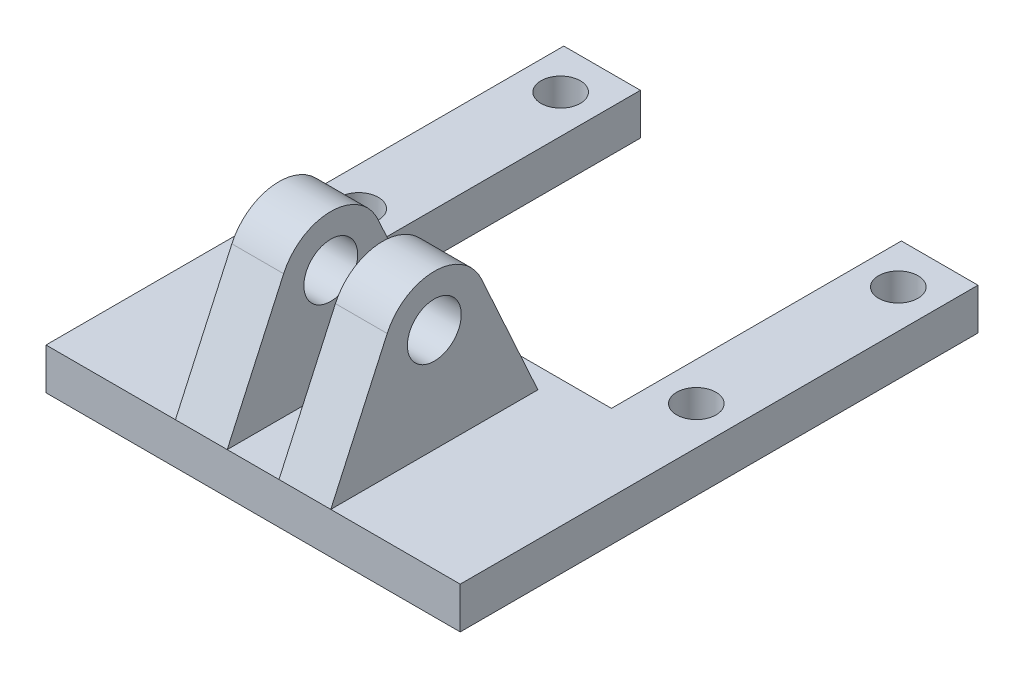
ISO-10303-21;
HEADER;
FILE_DESCRIPTION(('STEP AP214'),'2;1');
FILE_NAME('part.step','',(''),(''),'','','');
FILE_SCHEMA(('AUTOMOTIVE_DESIGN { 1 0 10303 214 1 1 1 1 }'));
ENDSEC;
DATA;
#1=APPLICATION_CONTEXT('core data for automotive mechanical design processes');
#2=APPLICATION_PROTOCOL_DEFINITION('international standard','automotive_design',2000,#1);
#3=PRODUCT_CONTEXT('',#1,'mechanical');
#4=PRODUCT('Part','Part','',(#3));
#5=PRODUCT_RELATED_PRODUCT_CATEGORY('part','',(#4));
#6=PRODUCT_DEFINITION_FORMATION('','',#4);
#7=PRODUCT_DEFINITION_CONTEXT('part definition',#1,'design');
#8=PRODUCT_DEFINITION('design','',#6,#7);
#9=PRODUCT_DEFINITION_SHAPE('','',#8);
#10=(LENGTH_UNIT() NAMED_UNIT(*) SI_UNIT(.MILLI.,.METRE.));
#11=(NAMED_UNIT(*) PLANE_ANGLE_UNIT() SI_UNIT($,.RADIAN.));
#12=(NAMED_UNIT(*) SI_UNIT($,.STERADIAN.) SOLID_ANGLE_UNIT());
#13=UNCERTAINTY_MEASURE_WITH_UNIT(LENGTH_MEASURE(1.E-05),#10,'distance_accuracy_value','');
#14=(GEOMETRIC_REPRESENTATION_CONTEXT(3) GLOBAL_UNCERTAINTY_ASSIGNED_CONTEXT((#13)) GLOBAL_UNIT_ASSIGNED_CONTEXT((#10,
#11,#12)) REPRESENTATION_CONTEXT('',''));
#15=CARTESIAN_POINT('',(0.,0.,0.));
#16=DIRECTION('',(0.,0.,1.));
#17=DIRECTION('',(1.,0.,0.));
#18=AXIS2_PLACEMENT_3D('',#15,#16,#17);
#19=CARTESIAN_POINT('',(4.7625,16.51,-6.35));
#20=DIRECTION('',(0.,-0.413802944301184,-0.910366477462605));
#21=DIRECTION('',(0.,0.910366477462605,-0.413802944301184));
#22=AXIS2_PLACEMENT_3D('',#19,#20,#21);
#23=PLANE('',#22);
#24=DIRECTION('',(0.,-0.910366477462605,0.413802944301184));
#25=VECTOR('',#24,1.);
#26=CARTESIAN_POINT('',(-1.5875,16.51,-6.35));
#27=LINE('',#26,#25);
#28=CARTESIAN_POINT('',(-1.5875,10.1510901549237,-3.45958643405622));
#29=VERTEX_POINT('',#28);
#30=CARTESIAN_POINT('',(-1.5875,2.54,0.));
#31=VERTEX_POINT('',#30);
#32=EDGE_CURVE('E157',#29,#31,#27,.T.);
#33=ORIENTED_EDGE('',*,*,#32,.F.);
#34=DIRECTION('',(-1.,0.,0.));
#35=VECTOR('',#34,1.);
#36=CARTESIAN_POINT('',(4.7625,10.1510901549237,-3.45958643405623));
#37=LINE('',#36,#35);
#38=CARTESIAN_POINT('',(-4.7625,10.1510901549237,-3.45958643405623));
#39=VERTEX_POINT('',#38);
#40=EDGE_CURVE('E320',#29,#39,#37,.T.);
#41=ORIENTED_EDGE('',*,*,#40,.T.);
#42=DIRECTION('',(0.,-0.910366477462605,0.413802944301184));
#43=VECTOR('',#42,1.);
#44=CARTESIAN_POINT('',(-4.7625,16.51,-6.35));
#45=LINE('',#44,#43);
#46=CARTESIAN_POINT('',(-4.7625,2.54,0.));
#47=VERTEX_POINT('',#46);
#48=EDGE_CURVE('E181',#39,#47,#45,.T.);
#49=ORIENTED_EDGE('',*,*,#48,.T.);
#50=DIRECTION('',(-1.,0.,0.));
#51=VECTOR('',#50,1.);
#52=CARTESIAN_POINT('',(4.7625,2.54,0.));
#53=LINE('',#52,#51);
#54=EDGE_CURVE('E180',#31,#47,#53,.T.);
#55=ORIENTED_EDGE('',*,*,#54,.F.);
#56=EDGE_LOOP('',(#33,#41,#49,#55));
#57=FACE_BOUND('',#56,.T.);
#58=ADVANCED_FACE('F45',(#57),#23,.F.);
#59=DIRECTION('',(0.,-0.910366477462605,0.413802944301184));
#60=VECTOR('',#59,1.);
#61=CARTESIAN_POINT('',(4.7625,16.51,-6.35));
#62=LINE('',#61,#60);
#63=CARTESIAN_POINT('',(4.7625,10.1510901549237,-3.45958643405623));
#64=VERTEX_POINT('',#63);
#65=CARTESIAN_POINT('',(4.7625,2.54,0.));
#66=VERTEX_POINT('',#65);
#67=EDGE_CURVE('E210',#64,#66,#62,.T.);
#68=ORIENTED_EDGE('',*,*,#67,.F.);
#69=DIRECTION('',(-1.,0.,0.));
#70=VECTOR('',#69,1.);
#71=CARTESIAN_POINT('',(4.7625,10.1510901549237,-3.45958643405623));
#72=LINE('',#71,#70);
#73=CARTESIAN_POINT('',(1.5875,10.1510901549237,-3.45958643405622));
#74=VERTEX_POINT('',#73);
#75=EDGE_CURVE('E307',#64,#74,#72,.T.);
#76=ORIENTED_EDGE('',*,*,#75,.T.);
#77=DIRECTION('',(0.,0.910366477462605,-0.413802944301184));
#78=VECTOR('',#77,1.);
#79=CARTESIAN_POINT('',(1.5875,16.51,-6.35));
#80=LINE('',#79,#78);
#81=CARTESIAN_POINT('',(1.5875,2.54,0.));
#82=VERTEX_POINT('',#81);
#83=EDGE_CURVE('E200',#82,#74,#80,.T.);
#84=ORIENTED_EDGE('',*,*,#83,.F.);
#85=EDGE_CURVE('E185',#66,#82,#53,.T.);
#86=ORIENTED_EDGE('',*,*,#85,.F.);
#87=EDGE_LOOP('',(#68,#76,#84,#86));
#88=FACE_BOUND('',#87,.T.);
#89=ADVANCED_FACE('F351',(#88),#23,.F.);
#90=CARTESIAN_POINT('',(4.7625,2.54,-12.7));
#91=DIRECTION('',(0.,-0.413802944301184,0.910366477462605));
#92=DIRECTION('',(0.,-0.910366477462605,-0.413802944301184));
#93=AXIS2_PLACEMENT_3D('',#90,#91,#92);
#94=PLANE('',#93);
#95=DIRECTION('',(0.,0.910366477462605,0.413802944301184));
#96=VECTOR('',#95,1.);
#97=CARTESIAN_POINT('',(-4.7625,2.54,-12.7));
#98=LINE('',#97,#96);
#99=CARTESIAN_POINT('',(-4.7625,2.54,-12.7));
#100=VERTEX_POINT('',#99);
#101=CARTESIAN_POINT('',(-4.7625,10.1510901549237,-9.24041356594377));
#102=VERTEX_POINT('',#101);
#103=EDGE_CURVE('E213',#100,#102,#98,.T.);
#104=ORIENTED_EDGE('',*,*,#103,.T.);
#105=DIRECTION('',(-1.,0.,0.));
#106=VECTOR('',#105,1.);
#107=CARTESIAN_POINT('',(4.7625,10.1510901549237,-9.24041356594377));
#108=LINE('',#107,#106);
#109=CARTESIAN_POINT('',(-1.5875,10.1510901549237,-9.24041356594377));
#110=VERTEX_POINT('',#109);
#111=EDGE_CURVE('E53',#102,#110,#108,.F.);
#112=ORIENTED_EDGE('',*,*,#111,.T.);
#113=DIRECTION('',(0.,0.910366477462605,0.413802944301184));
#114=VECTOR('',#113,1.);
#115=CARTESIAN_POINT('',(-1.5875,2.54,-12.7));
#116=LINE('',#115,#114);
#117=CARTESIAN_POINT('',(-1.5875,2.54,-12.7));
#118=VERTEX_POINT('',#117);
#119=EDGE_CURVE('E167',#118,#110,#116,.T.);
#120=ORIENTED_EDGE('',*,*,#119,.F.);
#121=DIRECTION('',(-1.,0.,0.));
#122=VECTOR('',#121,1.);
#123=CARTESIAN_POINT('',(4.7625,2.54,-12.7));
#124=LINE('',#123,#122);
#125=EDGE_CURVE('E177',#118,#100,#124,.T.);
#126=ORIENTED_EDGE('',*,*,#125,.T.);
#127=EDGE_LOOP('',(#104,#112,#120,#126));
#128=FACE_BOUND('',#127,.T.);
#129=ADVANCED_FACE('F373',(#128),#94,.F.);
#130=DIRECTION('',(0.,-0.910366477462605,-0.413802944301184));
#131=VECTOR('',#130,1.);
#132=CARTESIAN_POINT('',(1.5875,2.54,-12.7));
#133=LINE('',#132,#131);
#134=CARTESIAN_POINT('',(1.5875,10.1510901549237,-9.24041356594377));
#135=VERTEX_POINT('',#134);
#136=CARTESIAN_POINT('',(1.5875,2.54,-12.7));
#137=VERTEX_POINT('',#136);
#138=EDGE_CURVE('E198',#135,#137,#133,.T.);
#139=ORIENTED_EDGE('',*,*,#138,.F.);
#140=DIRECTION('',(-1.,0.,0.));
#141=VECTOR('',#140,1.);
#142=CARTESIAN_POINT('',(4.7625,10.1510901549237,-9.24041356594377));
#143=LINE('',#142,#141);
#144=CARTESIAN_POINT('',(4.7625,10.1510901549237,-9.24041356594377));
#145=VERTEX_POINT('',#144);
#146=EDGE_CURVE('E316',#135,#145,#143,.F.);
#147=ORIENTED_EDGE('',*,*,#146,.T.);
#148=DIRECTION('',(0.,0.910366477462605,0.413802944301184));
#149=VECTOR('',#148,1.);
#150=CARTESIAN_POINT('',(4.7625,2.54,-12.7));
#151=LINE('',#150,#149);
#152=CARTESIAN_POINT('',(4.7625,2.54,-12.7));
#153=VERTEX_POINT('',#152);
#154=EDGE_CURVE('E216',#153,#145,#151,.T.);
#155=ORIENTED_EDGE('',*,*,#154,.F.);
#156=EDGE_CURVE('E186',#153,#137,#124,.T.);
#157=ORIENTED_EDGE('',*,*,#156,.T.);
#158=EDGE_LOOP('',(#139,#147,#155,#157));
#159=FACE_BOUND('',#158,.T.);
#160=ADVANCED_FACE('F356',(#159),#94,.F.);
#161=CARTESIAN_POINT('',(4.7625,8.89,-6.35));
#162=DIRECTION('',(-1.,0.,0.));
#163=DIRECTION('',(0.,0.,1.));
#164=AXIS2_PLACEMENT_3D('',#161,#162,#163);
#165=CYLINDRICAL_SURFACE('',#164,1.651);
#166=CARTESIAN_POINT('',(-4.7625,8.89,-6.35));
#167=DIRECTION('',(1.,0.,0.));
#168=DIRECTION('',(0.,0.,-1.));
#169=AXIS2_PLACEMENT_3D('',#166,#167,#168);
#170=CIRCLE('',#169,1.651);
#171=CARTESIAN_POINT('',(-4.7625,8.89,-4.699));
#172=VERTEX_POINT('',#171);
#173=EDGE_CURVE('E166',#172,#172,#170,.T.);
#174=CARTESIAN_POINT('',(-1.5875,8.89,-6.35));
#175=DIRECTION('',(1.,0.,0.));
#176=DIRECTION('',(0.,0.,-1.));
#177=AXIS2_PLACEMENT_3D('',#174,#175,#176);
#178=CIRCLE('',#177,1.651);
#179=CARTESIAN_POINT('',(-1.5875,8.89,-4.699));
#180=VERTEX_POINT('',#179);
#181=EDGE_CURVE('E203',#180,#180,#178,.T.);
#182=CARTESIAN_POINT('',(-4.7625,8.89,-4.699));
#183=CARTESIAN_POINT('',(-4.72942708333333,8.89,-4.699));
#184=CARTESIAN_POINT('',(-4.69635416666667,8.89,-4.699));
#185=CARTESIAN_POINT('',(-4.63020833333333,8.89,-4.699));
#186=CARTESIAN_POINT('',(-4.59713541666667,8.89,-4.699));
#187=CARTESIAN_POINT('',(-4.53098958333333,8.89,-4.699));
#188=CARTESIAN_POINT('',(-4.49791666666667,8.89,-4.699));
#189=CARTESIAN_POINT('',(-4.43177083333333,8.89,-4.699));
#190=CARTESIAN_POINT('',(-4.39869791666667,8.89,-4.699));
#191=CARTESIAN_POINT('',(-4.33255208333333,8.89,-4.699));
#192=CARTESIAN_POINT('',(-4.29947916666667,8.89,-4.699));
#193=CARTESIAN_POINT('',(-4.23333333333333,8.89,-4.699));
#194=CARTESIAN_POINT('',(-4.20026041666667,8.89,-4.699));
#195=CARTESIAN_POINT('',(-4.13411458333333,8.89,-4.699));
#196=CARTESIAN_POINT('',(-4.10104166666667,8.89,-4.699));
#197=CARTESIAN_POINT('',(-4.03489583333333,8.89,-4.699));
#198=CARTESIAN_POINT('',(-4.00182291666667,8.89,-4.699));
#199=CARTESIAN_POINT('',(-3.93567708333333,8.89,-4.699));
#200=CARTESIAN_POINT('',(-3.90260416666667,8.89,-4.699));
#201=CARTESIAN_POINT('',(-3.83645833333333,8.89,-4.699));
#202=CARTESIAN_POINT('',(-3.80338541666667,8.89,-4.699));
#203=CARTESIAN_POINT('',(-3.73723958333333,8.89,-4.699));
#204=CARTESIAN_POINT('',(-3.70416666666667,8.89,-4.699));
#205=CARTESIAN_POINT('',(-3.63802083333333,8.89,-4.699));
#206=CARTESIAN_POINT('',(-3.60494791666667,8.89,-4.699));
#207=CARTESIAN_POINT('',(-3.53880208333333,8.89,-4.699));
#208=CARTESIAN_POINT('',(-3.50572916666667,8.89,-4.699));
#209=CARTESIAN_POINT('',(-3.43958333333333,8.89,-4.699));
#210=CARTESIAN_POINT('',(-3.40651041666667,8.89,-4.699));
#211=CARTESIAN_POINT('',(-3.34036458333333,8.89,-4.699));
#212=CARTESIAN_POINT('',(-3.30729166666667,8.89,-4.699));
#213=CARTESIAN_POINT('',(-3.24114583333333,8.89,-4.699));
#214=CARTESIAN_POINT('',(-3.20807291666667,8.89,-4.699));
#215=CARTESIAN_POINT('',(-3.14192708333333,8.89,-4.699));
#216=CARTESIAN_POINT('',(-3.10885416666667,8.89,-4.699));
#217=CARTESIAN_POINT('',(-3.04270833333333,8.89,-4.699));
#218=CARTESIAN_POINT('',(-3.00963541666667,8.89,-4.699));
#219=CARTESIAN_POINT('',(-2.94348958333333,8.89,-4.699));
#220=CARTESIAN_POINT('',(-2.91041666666667,8.89,-4.699));
#221=CARTESIAN_POINT('',(-2.84427083333333,8.89,-4.699));
#222=CARTESIAN_POINT('',(-2.81119791666667,8.89,-4.699));
#223=CARTESIAN_POINT('',(-2.74505208333333,8.89,-4.699));
#224=CARTESIAN_POINT('',(-2.71197916666667,8.89,-4.699));
#225=CARTESIAN_POINT('',(-2.64583333333333,8.89,-4.699));
#226=CARTESIAN_POINT('',(-2.61276041666667,8.89,-4.699));
#227=CARTESIAN_POINT('',(-2.54661458333333,8.89,-4.699));
#228=CARTESIAN_POINT('',(-2.51354166666667,8.89,-4.699));
#229=CARTESIAN_POINT('',(-2.44739583333333,8.89,-4.699));
#230=CARTESIAN_POINT('',(-2.41432291666667,8.89,-4.699));
#231=CARTESIAN_POINT('',(-2.34817708333333,8.89,-4.699));
#232=CARTESIAN_POINT('',(-2.31510416666667,8.89,-4.699));
#233=CARTESIAN_POINT('',(-2.24895833333333,8.89,-4.699));
#234=CARTESIAN_POINT('',(-2.21588541666667,8.89,-4.699));
#235=CARTESIAN_POINT('',(-2.14973958333333,8.89,-4.699));
#236=CARTESIAN_POINT('',(-2.11666666666667,8.89,-4.699));
#237=CARTESIAN_POINT('',(-2.05052083333333,8.89,-4.699));
#238=CARTESIAN_POINT('',(-2.01744791666667,8.89,-4.699));
#239=CARTESIAN_POINT('',(-1.95130208333333,8.89,-4.699));
#240=CARTESIAN_POINT('',(-1.91822916666667,8.89,-4.699));
#241=CARTESIAN_POINT('',(-1.85208333333333,8.89,-4.699));
#242=CARTESIAN_POINT('',(-1.81901041666667,8.89,-4.699));
#243=CARTESIAN_POINT('',(-1.75286458333333,8.89,-4.699));
#244=CARTESIAN_POINT('',(-1.71979166666667,8.89,-4.699));
#245=CARTESIAN_POINT('',(-1.65364583333333,8.89,-4.699));
#246=CARTESIAN_POINT('',(-1.62057291666667,8.89,-4.699));
#247=CARTESIAN_POINT('',(-1.5875,8.89,-4.699));
#248=B_SPLINE_CURVE_WITH_KNOTS('',3,(#182,#183,#184,#185,#186,#187,#188,#189,#190,#191,#192,
#193,#194,#195,#196,#197,#198,#199,#200,#201,#202,#203,#204,#205,#206,#207,#208,#209,#210,#211,
#212,#213,#214,#215,#216,#217,#218,#219,#220,#221,#222,#223,#224,#225,#226,#227,#228,#229,#230,
#231,#232,#233,#234,#235,#236,#237,#238,#239,#240,#241,#242,#243,#244,#245,#246,#247),
.UNSPECIFIED.,.F.,.F.,(4,2,2,2,2,2,2,2,2,2,2,2,2,2,2,2,2,2,2,2,2,2,2,2,2,2,2,2,2,2,2,2,4),(0.,
0.0992187499999995,0.198437500000001,0.29765625,0.396875,0.496093750000001,0.5953125,0.69453125,
0.793749999999999,0.892968750000001,0.9921875,1.09140625,1.190625,1.28984375,1.3890625,
1.48828125,1.5875,1.68671875,1.7859375,1.88515625,1.984375,2.08359375,2.1828125,2.28203125,
2.38125,2.48046875,2.5796875,2.67890625,2.778125,2.87734375,2.9765625,3.07578125,3.175),.UNSPECIFIED.);
#249=EDGE_CURVE('BSEAM542',#172,#180,#248,.T.);
#250=ORIENTED_EDGE('',*,*,#173,.F.);
#251=ORIENTED_EDGE('',*,*,#181,.T.);
#252=ORIENTED_EDGE('',*,*,#249,.T.);
#253=ORIENTED_EDGE('',*,*,#249,.F.);
#254=EDGE_LOOP('',(#250,#252,#251,#253));
#255=FACE_BOUND('',#254,.T.);
#256=ADVANCED_FACE('F542',(#255),#165,.F.);
#257=CARTESIAN_POINT('',(4.7625,8.89,-6.35));
#258=DIRECTION('',(1.,0.,0.));
#259=DIRECTION('',(0.,0.,-1.));
#260=AXIS2_PLACEMENT_3D('',#257,#258,#259);
#261=CIRCLE('',#260,1.651);
#262=CARTESIAN_POINT('',(4.7625,8.89,-4.699));
#263=VERTEX_POINT('',#262);
#264=EDGE_CURVE('E205',#263,#263,#261,.T.);
#265=CARTESIAN_POINT('',(1.5875,8.89,-6.35));
#266=DIRECTION('',(-1.,0.,0.));
#267=DIRECTION('',(0.,0.,1.));
#268=AXIS2_PLACEMENT_3D('',#265,#266,#267);
#269=CIRCLE('',#268,1.651);
#270=CARTESIAN_POINT('',(1.5875,8.89,-4.699));
#271=VERTEX_POINT('',#270);
#272=EDGE_CURVE('E195',#271,#271,#269,.T.);
#273=CARTESIAN_POINT('',(4.7625,8.89,-4.699));
#274=CARTESIAN_POINT('',(4.72942708333333,8.89,-4.699));
#275=CARTESIAN_POINT('',(4.69635416666667,8.89,-4.699));
#276=CARTESIAN_POINT('',(4.63020833333333,8.89,-4.699));
#277=CARTESIAN_POINT('',(4.59713541666667,8.89,-4.699));
#278=CARTESIAN_POINT('',(4.53098958333333,8.89,-4.699));
#279=CARTESIAN_POINT('',(4.49791666666667,8.89,-4.699));
#280=CARTESIAN_POINT('',(4.43177083333333,8.89,-4.699));
#281=CARTESIAN_POINT('',(4.39869791666667,8.89,-4.699));
#282=CARTESIAN_POINT('',(4.33255208333333,8.89,-4.699));
#283=CARTESIAN_POINT('',(4.29947916666667,8.89,-4.699));
#284=CARTESIAN_POINT('',(4.23333333333333,8.89,-4.699));
#285=CARTESIAN_POINT('',(4.20026041666667,8.89,-4.699));
#286=CARTESIAN_POINT('',(4.13411458333333,8.89,-4.699));
#287=CARTESIAN_POINT('',(4.10104166666667,8.89,-4.699));
#288=CARTESIAN_POINT('',(4.03489583333333,8.89,-4.699));
#289=CARTESIAN_POINT('',(4.00182291666667,8.89,-4.699));
#290=CARTESIAN_POINT('',(3.93567708333333,8.89,-4.699));
#291=CARTESIAN_POINT('',(3.90260416666667,8.89,-4.699));
#292=CARTESIAN_POINT('',(3.83645833333333,8.89,-4.699));
#293=CARTESIAN_POINT('',(3.80338541666667,8.89,-4.699));
#294=CARTESIAN_POINT('',(3.73723958333333,8.89,-4.699));
#295=CARTESIAN_POINT('',(3.70416666666667,8.89,-4.699));
#296=CARTESIAN_POINT('',(3.63802083333333,8.89,-4.699));
#297=CARTESIAN_POINT('',(3.60494791666667,8.89,-4.699));
#298=CARTESIAN_POINT('',(3.53880208333333,8.89,-4.699));
#299=CARTESIAN_POINT('',(3.50572916666667,8.89,-4.699));
#300=CARTESIAN_POINT('',(3.43958333333333,8.89,-4.699));
#301=CARTESIAN_POINT('',(3.40651041666667,8.89,-4.699));
#302=CARTESIAN_POINT('',(3.34036458333333,8.89,-4.699));
#303=CARTESIAN_POINT('',(3.30729166666667,8.89,-4.699));
#304=CARTESIAN_POINT('',(3.24114583333333,8.89,-4.699));
#305=CARTESIAN_POINT('',(3.20807291666667,8.89,-4.699));
#306=CARTESIAN_POINT('',(3.14192708333333,8.89,-4.699));
#307=CARTESIAN_POINT('',(3.10885416666667,8.89,-4.699));
#308=CARTESIAN_POINT('',(3.04270833333333,8.89,-4.699));
#309=CARTESIAN_POINT('',(3.00963541666667,8.89,-4.699));
#310=CARTESIAN_POINT('',(2.94348958333333,8.89,-4.699));
#311=CARTESIAN_POINT('',(2.91041666666667,8.89,-4.699));
#312=CARTESIAN_POINT('',(2.84427083333333,8.89,-4.699));
#313=CARTESIAN_POINT('',(2.81119791666667,8.89,-4.699));
#314=CARTESIAN_POINT('',(2.74505208333333,8.89,-4.699));
#315=CARTESIAN_POINT('',(2.71197916666667,8.89,-4.699));
#316=CARTESIAN_POINT('',(2.64583333333333,8.89,-4.699));
#317=CARTESIAN_POINT('',(2.61276041666667,8.89,-4.699));
#318=CARTESIAN_POINT('',(2.54661458333333,8.89,-4.699));
#319=CARTESIAN_POINT('',(2.51354166666667,8.89,-4.699));
#320=CARTESIAN_POINT('',(2.44739583333333,8.89,-4.699));
#321=CARTESIAN_POINT('',(2.41432291666667,8.89,-4.699));
#322=CARTESIAN_POINT('',(2.34817708333333,8.89,-4.699));
#323=CARTESIAN_POINT('',(2.31510416666667,8.89,-4.699));
#324=CARTESIAN_POINT('',(2.24895833333333,8.89,-4.699));
#325=CARTESIAN_POINT('',(2.21588541666667,8.89,-4.699));
#326=CARTESIAN_POINT('',(2.14973958333333,8.89,-4.699));
#327=CARTESIAN_POINT('',(2.11666666666667,8.89,-4.699));
#328=CARTESIAN_POINT('',(2.05052083333333,8.89,-4.699));
#329=CARTESIAN_POINT('',(2.01744791666667,8.89,-4.699));
#330=CARTESIAN_POINT('',(1.95130208333333,8.89,-4.699));
#331=CARTESIAN_POINT('',(1.91822916666667,8.89,-4.699));
#332=CARTESIAN_POINT('',(1.85208333333333,8.89,-4.699));
#333=CARTESIAN_POINT('',(1.81901041666667,8.89,-4.699));
#334=CARTESIAN_POINT('',(1.75286458333333,8.89,-4.699));
#335=CARTESIAN_POINT('',(1.71979166666667,8.89,-4.699));
#336=CARTESIAN_POINT('',(1.65364583333333,8.89,-4.699));
#337=CARTESIAN_POINT('',(1.62057291666667,8.89,-4.699));
#338=CARTESIAN_POINT('',(1.5875,8.89,-4.699));
#339=B_SPLINE_CURVE_WITH_KNOTS('',3,(#273,#274,#275,#276,#277,#278,#279,#280,#281,#282,#283,
#284,#285,#286,#287,#288,#289,#290,#291,#292,#293,#294,#295,#296,#297,#298,#299,#300,#301,#302,
#303,#304,#305,#306,#307,#308,#309,#310,#311,#312,#313,#314,#315,#316,#317,#318,#319,#320,#321,
#322,#323,#324,#325,#326,#327,#328,#329,#330,#331,#332,#333,#334,#335,#336,#337,#338),
.UNSPECIFIED.,.F.,.F.,(4,2,2,2,2,2,2,2,2,2,2,2,2,2,2,2,2,2,2,2,2,2,2,2,2,2,2,2,2,2,2,2,4),(0.,
0.0992187500000004,0.198437500000001,0.29765625,0.396875000000001,0.49609375,0.5953125,
0.694531250000001,0.79375,0.892968750000001,0.9921875,1.09140625,1.190625,1.28984375,1.3890625,
1.48828125,1.5875,1.68671875,1.7859375,1.88515625,1.984375,2.08359375,2.1828125,2.28203125,
2.38125,2.48046875,2.5796875,2.67890625,2.778125,2.87734375,2.9765625,3.07578125,3.175),.UNSPECIFIED.);
#340=EDGE_CURVE('BSEAM396',#263,#271,#339,.T.);
#341=ORIENTED_EDGE('',*,*,#264,.T.);
#342=ORIENTED_EDGE('',*,*,#272,.T.);
#343=ORIENTED_EDGE('',*,*,#340,.T.);
#344=ORIENTED_EDGE('',*,*,#340,.F.);
#345=EDGE_LOOP('',(#341,#343,#342,#344));
#346=FACE_BOUND('',#345,.T.);
#347=ADVANCED_FACE('F396',(#346),#165,.F.);
#348=CARTESIAN_POINT('',(0.,2.54,0.));
#349=DIRECTION('',(0.,-1.,0.));
#350=DIRECTION('',(0.,0.,-1.));
#351=AXIS2_PLACEMENT_3D('',#348,#349,#350);
#352=PLANE('',#351);
#353=CARTESIAN_POINT('',(10.3505,2.54,-16.8275));
#354=DIRECTION('',(0.,1.,0.));
#355=DIRECTION('',(0.,0.,1.));
#356=AXIS2_PLACEMENT_3D('',#353,#354,#355);
#357=CIRCLE('',#356,1.2065);
#358=CARTESIAN_POINT('',(10.3505,2.54,-15.621));
#359=VERTEX_POINT('',#358);
#360=EDGE_CURVE('E226',#359,#359,#357,.T.);
#361=ORIENTED_EDGE('',*,*,#360,.F.);
#362=EDGE_LOOP('',(#361));
#363=FACE_BOUND('',#362,.T.);
#364=CARTESIAN_POINT('',(10.3505,2.54,-29.21));
#365=DIRECTION('',(0.,1.,0.));
#366=DIRECTION('',(0.,0.,1.));
#367=AXIS2_PLACEMENT_3D('',#364,#365,#366);
#368=CIRCLE('',#367,1.2065);
#369=CARTESIAN_POINT('',(10.3505,2.54,-28.0035));
#370=VERTEX_POINT('',#369);
#371=EDGE_CURVE('E232',#370,#370,#368,.T.);
#372=ORIENTED_EDGE('',*,*,#371,.F.);
#373=EDGE_LOOP('',(#372));
#374=FACE_BOUND('',#373,.T.);
#375=CARTESIAN_POINT('',(-10.3505,2.54,-16.8275));
#376=DIRECTION('',(0.,1.,0.));
#377=DIRECTION('',(0.,0.,1.));
#378=AXIS2_PLACEMENT_3D('',#375,#376,#377);
#379=CIRCLE('',#378,1.2065);
#380=CARTESIAN_POINT('',(-10.3505,2.54,-15.621));
#381=VERTEX_POINT('',#380);
#382=EDGE_CURVE('E238',#381,#381,#379,.T.);
#383=ORIENTED_EDGE('',*,*,#382,.F.);
#384=EDGE_LOOP('',(#383));
#385=FACE_BOUND('',#384,.T.);
#386=CARTESIAN_POINT('',(-10.3505,2.54,-29.21));
#387=DIRECTION('',(0.,1.,0.));
#388=DIRECTION('',(0.,0.,1.));
#389=AXIS2_PLACEMENT_3D('',#386,#387,#388);
#390=CIRCLE('',#389,1.2065);
#391=CARTESIAN_POINT('',(-10.3505,2.54,-28.0035));
#392=VERTEX_POINT('',#391);
#393=EDGE_CURVE('E244',#392,#392,#390,.T.);
#394=ORIENTED_EDGE('',*,*,#393,.F.);
#395=EDGE_LOOP('',(#394));
#396=FACE_BOUND('',#395,.T.);
#397=DIRECTION('',(0.,0.,1.));
#398=VECTOR('',#397,1.);
#399=CARTESIAN_POINT('',(-4.7625,2.54,-12.7));
#400=LINE('',#399,#398);
#401=EDGE_CURVE('E220',#100,#47,#400,.T.);
#402=ORIENTED_EDGE('',*,*,#401,.F.);
#403=ORIENTED_EDGE('',*,*,#125,.F.);
#404=DIRECTION('',(0.,0.,1.));
#405=VECTOR('',#404,1.);
#406=CARTESIAN_POINT('',(-1.5875,2.54,0.));
#407=LINE('',#406,#405);
#408=EDGE_CURVE('E160',#118,#31,#407,.T.);
#409=ORIENTED_EDGE('',*,*,#408,.T.);
#410=DIRECTION('',(1.,0.,0.));
#411=VECTOR('',#410,1.);
#412=CARTESIAN_POINT('',(-1.5875,2.54,0.));
#413=LINE('',#412,#411);
#414=EDGE_CURVE('E175',#31,#82,#413,.T.);
#415=ORIENTED_EDGE('',*,*,#414,.T.);
#416=DIRECTION('',(0.,0.,-1.));
#417=VECTOR('',#416,1.);
#418=CARTESIAN_POINT('',(1.5875,2.54,0.));
#419=LINE('',#418,#417);
#420=EDGE_CURVE('E193',#82,#137,#419,.T.);
#421=ORIENTED_EDGE('',*,*,#420,.T.);
#422=ORIENTED_EDGE('',*,*,#156,.F.);
#423=DIRECTION('',(0.,0.,1.));
#424=VECTOR('',#423,1.);
#425=CARTESIAN_POINT('',(4.7625,2.54,-12.7));
#426=LINE('',#425,#424);
#427=EDGE_CURVE('E212',#153,#66,#426,.T.);
#428=ORIENTED_EDGE('',*,*,#427,.T.);
#429=DIRECTION('',(1.,0.,0.));
#430=VECTOR('',#429,1.);
#431=CARTESIAN_POINT('',(12.7,2.54,0.));
#432=LINE('',#431,#430);
#433=CARTESIAN_POINT('',(12.7,2.54,0.));
#434=VERTEX_POINT('',#433);
#435=EDGE_CURVE('E254',#66,#434,#432,.T.);
#436=ORIENTED_EDGE('',*,*,#435,.T.);
#437=DIRECTION('',(0.,0.,-1.));
#438=VECTOR('',#437,1.);
#439=CARTESIAN_POINT('',(12.7,2.54,-31.75));
#440=LINE('',#439,#438);
#441=CARTESIAN_POINT('',(12.7,2.54,-31.75));
#442=VERTEX_POINT('',#441);
#443=EDGE_CURVE('E253',#434,#442,#440,.T.);
#444=ORIENTED_EDGE('',*,*,#443,.T.);
#445=DIRECTION('',(-1.,0.,0.));
#446=VECTOR('',#445,1.);
#447=CARTESIAN_POINT('',(8.001,2.54,-31.75));
#448=LINE('',#447,#446);
#449=CARTESIAN_POINT('',(8.001,2.54,-31.75));
#450=VERTEX_POINT('',#449);
#451=EDGE_CURVE('E256',#442,#450,#448,.T.);
#452=ORIENTED_EDGE('',*,*,#451,.T.);
#453=DIRECTION('',(0.,0.,1.));
#454=VECTOR('',#453,1.);
#455=CARTESIAN_POINT('',(8.00099999999999,2.54,-13.97));
#456=LINE('',#455,#454);
#457=CARTESIAN_POINT('',(8.00099999999999,2.54,-13.97));
#458=VERTEX_POINT('',#457);
#459=EDGE_CURVE('E258',#450,#458,#456,.T.);
#460=ORIENTED_EDGE('',*,*,#459,.T.);
#461=DIRECTION('',(-1.,0.,0.));
#462=VECTOR('',#461,1.);
#463=CARTESIAN_POINT('',(-8.00099999999999,2.54,-13.97));
#464=LINE('',#463,#462);
#465=CARTESIAN_POINT('',(-8.00099999999999,2.54,-13.97));
#466=VERTEX_POINT('',#465);
#467=EDGE_CURVE('E260',#458,#466,#464,.T.);
#468=ORIENTED_EDGE('',*,*,#467,.T.);
#469=DIRECTION('',(0.,0.,-1.));
#470=VECTOR('',#469,1.);
#471=CARTESIAN_POINT('',(-8.001,2.54,-31.75));
#472=LINE('',#471,#470);
#473=CARTESIAN_POINT('',(-8.001,2.54,-31.75));
#474=VERTEX_POINT('',#473);
#475=EDGE_CURVE('E262',#466,#474,#472,.T.);
#476=ORIENTED_EDGE('',*,*,#475,.T.);
#477=DIRECTION('',(-1.,0.,0.));
#478=VECTOR('',#477,1.);
#479=CARTESIAN_POINT('',(-12.7,2.54,-31.75));
#480=LINE('',#479,#478);
#481=CARTESIAN_POINT('',(-12.7,2.54,-31.75));
#482=VERTEX_POINT('',#481);
#483=EDGE_CURVE('E264',#474,#482,#480,.T.);
#484=ORIENTED_EDGE('',*,*,#483,.T.);
#485=DIRECTION('',(0.,0.,1.));
#486=VECTOR('',#485,1.);
#487=CARTESIAN_POINT('',(-12.7,2.54,0.));
#488=LINE('',#487,#486);
#489=CARTESIAN_POINT('',(-12.7,2.54,0.));
#490=VERTEX_POINT('',#489);
#491=EDGE_CURVE('E266',#482,#490,#488,.T.);
#492=ORIENTED_EDGE('',*,*,#491,.T.);
#493=EDGE_CURVE('E250',#490,#47,#432,.T.);
#494=ORIENTED_EDGE('',*,*,#493,.T.);
#495=EDGE_LOOP('',(#402,#403,#409,#415,#421,#422,#428,#436,#444,#452,#460,#468,#476,#484,#492,#494));
#496=FACE_BOUND('',#495,.T.);
#497=ADVANCED_FACE('F172',(#363,#374,#385,#396,#496),#352,.F.);
#498=CARTESIAN_POINT('',(0.,0.,0.));
#499=DIRECTION('',(0.,-1.,0.));
#500=DIRECTION('',(0.,0.,-1.));
#501=AXIS2_PLACEMENT_3D('',#498,#499,#500);
#502=PLANE('',#501);
#503=CARTESIAN_POINT('',(10.3505,0.,-29.21));
#504=DIRECTION('',(0.,1.,0.));
#505=DIRECTION('',(0.,0.,1.));
#506=AXIS2_PLACEMENT_3D('',#503,#504,#505);
#507=CIRCLE('',#506,1.2065);
#508=CARTESIAN_POINT('',(10.3505,0.,-28.0035));
#509=VERTEX_POINT('',#508);
#510=EDGE_CURVE('E229',#509,#509,#507,.T.);
#511=ORIENTED_EDGE('',*,*,#510,.T.);
#512=EDGE_LOOP('',(#511));
#513=FACE_BOUND('',#512,.T.);
#514=CARTESIAN_POINT('',(-10.3505,0.,-29.21));
#515=DIRECTION('',(0.,1.,0.));
#516=DIRECTION('',(0.,0.,1.));
#517=AXIS2_PLACEMENT_3D('',#514,#515,#516);
#518=CIRCLE('',#517,1.2065);
#519=CARTESIAN_POINT('',(-10.3505,0.,-28.0035));
#520=VERTEX_POINT('',#519);
#521=EDGE_CURVE('E241',#520,#520,#518,.T.);
#522=ORIENTED_EDGE('',*,*,#521,.T.);
#523=EDGE_LOOP('',(#522));
#524=FACE_BOUND('',#523,.T.);
#525=DIRECTION('',(1.,0.,0.));
#526=VECTOR('',#525,1.);
#527=CARTESIAN_POINT('',(12.7,0.,0.));
#528=LINE('',#527,#526);
#529=CARTESIAN_POINT('',(-12.7,0.,0.));
#530=VERTEX_POINT('',#529);
#531=CARTESIAN_POINT('',(12.7,0.,0.));
#532=VERTEX_POINT('',#531);
#533=EDGE_CURVE('E247',#530,#532,#528,.T.);
#534=ORIENTED_EDGE('',*,*,#533,.F.);
#535=DIRECTION('',(0.,0.,1.));
#536=VECTOR('',#535,1.);
#537=CARTESIAN_POINT('',(-12.7,0.,0.));
#538=LINE('',#537,#536);
#539=CARTESIAN_POINT('',(-12.7,0.,-31.75));
#540=VERTEX_POINT('',#539);
#541=EDGE_CURVE('E282',#540,#530,#538,.T.);
#542=ORIENTED_EDGE('',*,*,#541,.F.);
#543=DIRECTION('',(-1.,0.,0.));
#544=VECTOR('',#543,1.);
#545=CARTESIAN_POINT('',(-12.7,0.,-31.75));
#546=LINE('',#545,#544);
#547=CARTESIAN_POINT('',(-8.001,0.,-31.75));
#548=VERTEX_POINT('',#547);
#549=EDGE_CURVE('E280',#548,#540,#546,.T.);
#550=ORIENTED_EDGE('',*,*,#549,.F.);
#551=DIRECTION('',(0.,0.,-1.));
#552=VECTOR('',#551,1.);
#553=CARTESIAN_POINT('',(-8.001,0.,-31.75));
#554=LINE('',#553,#552);
#555=CARTESIAN_POINT('',(-8.00099999999999,0.,-13.97));
#556=VERTEX_POINT('',#555);
#557=EDGE_CURVE('E278',#556,#548,#554,.T.);
#558=ORIENTED_EDGE('',*,*,#557,.F.);
#559=DIRECTION('',(-1.,0.,0.));
#560=VECTOR('',#559,1.);
#561=CARTESIAN_POINT('',(-8.00099999999999,0.,-13.97));
#562=LINE('',#561,#560);
#563=CARTESIAN_POINT('',(8.00099999999999,0.,-13.97));
#564=VERTEX_POINT('',#563);
#565=EDGE_CURVE('E276',#564,#556,#562,.T.);
#566=ORIENTED_EDGE('',*,*,#565,.F.);
#567=DIRECTION('',(0.,0.,1.));
#568=VECTOR('',#567,1.);
#569=CARTESIAN_POINT('',(8.00099999999999,0.,-13.97));
#570=LINE('',#569,#568);
#571=CARTESIAN_POINT('',(8.001,0.,-31.75));
#572=VERTEX_POINT('',#571);
#573=EDGE_CURVE('E274',#572,#564,#570,.T.);
#574=ORIENTED_EDGE('',*,*,#573,.F.);
#575=DIRECTION('',(-1.,0.,0.));
#576=VECTOR('',#575,1.);
#577=CARTESIAN_POINT('',(8.001,0.,-31.75));
#578=LINE('',#577,#576);
#579=CARTESIAN_POINT('',(12.7,0.,-31.75));
#580=VERTEX_POINT('',#579);
#581=EDGE_CURVE('E272',#580,#572,#578,.T.);
#582=ORIENTED_EDGE('',*,*,#581,.F.);
#583=DIRECTION('',(0.,0.,-1.));
#584=VECTOR('',#583,1.);
#585=CARTESIAN_POINT('',(12.7,0.,-31.75));
#586=LINE('',#585,#584);
#587=EDGE_CURVE('E270',#532,#580,#586,.T.);
#588=ORIENTED_EDGE('',*,*,#587,.F.);
#589=EDGE_LOOP('',(#534,#542,#550,#558,#566,#574,#582,#588));
#590=FACE_BOUND('',#589,.T.);
#591=CARTESIAN_POINT('',(-10.3505,0.,-16.8275));
#592=DIRECTION('',(0.,1.,0.));
#593=DIRECTION('',(0.,0.,1.));
#594=AXIS2_PLACEMENT_3D('',#591,#592,#593);
#595=CIRCLE('',#594,1.2065);
#596=CARTESIAN_POINT('',(-10.3505,0.,-15.621));
#597=VERTEX_POINT('',#596);
#598=EDGE_CURVE('E235',#597,#597,#595,.T.);
#599=ORIENTED_EDGE('',*,*,#598,.T.);
#600=EDGE_LOOP('',(#599));
#601=FACE_BOUND('',#600,.T.);
#602=CARTESIAN_POINT('',(10.3505,0.,-16.8275));
#603=DIRECTION('',(0.,1.,0.));
#604=DIRECTION('',(0.,0.,1.));
#605=AXIS2_PLACEMENT_3D('',#602,#603,#604);
#606=CIRCLE('',#605,1.2065);
#607=CARTESIAN_POINT('',(10.3505,0.,-15.621));
#608=VERTEX_POINT('',#607);
#609=EDGE_CURVE('E225',#608,#608,#606,.T.);
#610=ORIENTED_EDGE('',*,*,#609,.T.);
#611=EDGE_LOOP('',(#610));
#612=FACE_BOUND('',#611,.T.);
#613=ADVANCED_FACE('F332',(#513,#524,#590,#601,#612),#502,.T.);
#614=CARTESIAN_POINT('',(12.7,2.54,0.));
#615=DIRECTION('',(0.,0.,-1.));
#616=DIRECTION('',(-1.,0.,0.));
#617=AXIS2_PLACEMENT_3D('',#614,#615,#616);
#618=PLANE('',#617);
#619=ORIENTED_EDGE('',*,*,#533,.T.);
#620=DIRECTION('',(0.,-1.,0.));
#621=VECTOR('',#620,1.);
#622=CARTESIAN_POINT('',(12.7,2.54,0.));
#623=LINE('',#622,#621);
#624=EDGE_CURVE('E304',#434,#532,#623,.T.);
#625=ORIENTED_EDGE('',*,*,#624,.F.);
#626=ORIENTED_EDGE('',*,*,#435,.F.);
#627=ORIENTED_EDGE('',*,*,#85,.T.);
#628=ORIENTED_EDGE('',*,*,#414,.F.);
#629=ORIENTED_EDGE('',*,*,#54,.T.);
#630=ORIENTED_EDGE('',*,*,#493,.F.);
#631=DIRECTION('',(0.,-1.,0.));
#632=VECTOR('',#631,1.);
#633=CARTESIAN_POINT('',(-12.7,2.54,0.));
#634=LINE('',#633,#632);
#635=EDGE_CURVE('E268',#490,#530,#634,.T.);
#636=ORIENTED_EDGE('',*,*,#635,.T.);
#637=EDGE_LOOP('',(#619,#625,#626,#627,#628,#629,#630,#636));
#638=FACE_BOUND('',#637,.T.);
#639=ADVANCED_FACE('F190',(#638),#618,.F.);
#640=CARTESIAN_POINT('',(12.7,2.54,-31.75));
#641=DIRECTION('',(-1.,0.,0.));
#642=DIRECTION('',(0.,0.,1.));
#643=AXIS2_PLACEMENT_3D('',#640,#641,#642);
#644=PLANE('',#643);
#645=ORIENTED_EDGE('',*,*,#587,.T.);
#646=DIRECTION('',(0.,-1.,0.));
#647=VECTOR('',#646,1.);
#648=CARTESIAN_POINT('',(12.7,2.54,-31.75));
#649=LINE('',#648,#647);
#650=EDGE_CURVE('E301',#442,#580,#649,.T.);
#651=ORIENTED_EDGE('',*,*,#650,.F.);
#652=ORIENTED_EDGE('',*,*,#443,.F.);
#653=ORIENTED_EDGE('',*,*,#624,.T.);
#654=EDGE_LOOP('',(#645,#651,#652,#653));
#655=FACE_BOUND('',#654,.T.);
#656=ADVANCED_FACE('F340',(#655),#644,.F.);
#657=CARTESIAN_POINT('',(8.001,2.54,-31.75));
#658=DIRECTION('',(0.,0.,1.));
#659=DIRECTION('',(1.,0.,0.));
#660=AXIS2_PLACEMENT_3D('',#657,#658,#659);
#661=PLANE('',#660);
#662=ORIENTED_EDGE('',*,*,#581,.T.);
#663=DIRECTION('',(0.,-1.,0.));
#664=VECTOR('',#663,1.);
#665=CARTESIAN_POINT('',(8.001,2.54,-31.75));
#666=LINE('',#665,#664);
#667=EDGE_CURVE('E298',#450,#572,#666,.T.);
#668=ORIENTED_EDGE('',*,*,#667,.F.);
#669=ORIENTED_EDGE('',*,*,#451,.F.);
#670=ORIENTED_EDGE('',*,*,#650,.T.);
#671=EDGE_LOOP('',(#662,#668,#669,#670));
#672=FACE_BOUND('',#671,.T.);
#673=ADVANCED_FACE('F418',(#672),#661,.F.);
#674=CARTESIAN_POINT('',(8.00099999999999,2.54,-13.97));
#675=DIRECTION('',(1.,0.,0.));
#676=DIRECTION('',(0.,0.,-1.));
#677=AXIS2_PLACEMENT_3D('',#674,#675,#676);
#678=PLANE('',#677);
#679=ORIENTED_EDGE('',*,*,#573,.T.);
#680=DIRECTION('',(0.,-1.,0.));
#681=VECTOR('',#680,1.);
#682=CARTESIAN_POINT('',(8.00099999999999,2.54,-13.97));
#683=LINE('',#682,#681);
#684=EDGE_CURVE('E295',#458,#564,#683,.T.);
#685=ORIENTED_EDGE('',*,*,#684,.F.);
#686=ORIENTED_EDGE('',*,*,#459,.F.);
#687=ORIENTED_EDGE('',*,*,#667,.T.);
#688=EDGE_LOOP('',(#679,#685,#686,#687));
#689=FACE_BOUND('',#688,.T.);
#690=ADVANCED_FACE('F414',(#689),#678,.F.);
#691=CARTESIAN_POINT('',(-8.00099999999999,2.54,-13.97));
#692=DIRECTION('',(0.,0.,1.));
#693=DIRECTION('',(1.,0.,0.));
#694=AXIS2_PLACEMENT_3D('',#691,#692,#693);
#695=PLANE('',#694);
#696=ORIENTED_EDGE('',*,*,#565,.T.);
#697=DIRECTION('',(0.,-1.,0.));
#698=VECTOR('',#697,1.);
#699=CARTESIAN_POINT('',(-8.00099999999999,2.54,-13.97));
#700=LINE('',#699,#698);
#701=EDGE_CURVE('E292',#466,#556,#700,.T.);
#702=ORIENTED_EDGE('',*,*,#701,.F.);
#703=ORIENTED_EDGE('',*,*,#467,.F.);
#704=ORIENTED_EDGE('',*,*,#684,.T.);
#705=EDGE_LOOP('',(#696,#702,#703,#704));
#706=FACE_BOUND('',#705,.T.);
#707=ADVANCED_FACE('F410',(#706),#695,.F.);
#708=CARTESIAN_POINT('',(-8.001,2.54,-31.75));
#709=DIRECTION('',(-1.,0.,0.));
#710=DIRECTION('',(0.,0.,1.));
#711=AXIS2_PLACEMENT_3D('',#708,#709,#710);
#712=PLANE('',#711);
#713=ORIENTED_EDGE('',*,*,#557,.T.);
#714=DIRECTION('',(0.,-1.,0.));
#715=VECTOR('',#714,1.);
#716=CARTESIAN_POINT('',(-8.001,2.54,-31.75));
#717=LINE('',#716,#715);
#718=EDGE_CURVE('E289',#474,#548,#717,.T.);
#719=ORIENTED_EDGE('',*,*,#718,.F.);
#720=ORIENTED_EDGE('',*,*,#475,.F.);
#721=ORIENTED_EDGE('',*,*,#701,.T.);
#722=EDGE_LOOP('',(#713,#719,#720,#721));
#723=FACE_BOUND('',#722,.T.);
#724=ADVANCED_FACE('F406',(#723),#712,.F.);
#725=CARTESIAN_POINT('',(-12.7,2.54,-31.75));
#726=DIRECTION('',(0.,0.,1.));
#727=DIRECTION('',(1.,0.,0.));
#728=AXIS2_PLACEMENT_3D('',#725,#726,#727);
#729=PLANE('',#728);
#730=ORIENTED_EDGE('',*,*,#549,.T.);
#731=DIRECTION('',(0.,-1.,0.));
#732=VECTOR('',#731,1.);
#733=CARTESIAN_POINT('',(-12.7,2.54,-31.75));
#734=LINE('',#733,#732);
#735=EDGE_CURVE('E286',#482,#540,#734,.T.);
#736=ORIENTED_EDGE('',*,*,#735,.F.);
#737=ORIENTED_EDGE('',*,*,#483,.F.);
#738=ORIENTED_EDGE('',*,*,#718,.T.);
#739=EDGE_LOOP('',(#730,#736,#737,#738));
#740=FACE_BOUND('',#739,.T.);
#741=ADVANCED_FACE('F403',(#740),#729,.F.);
#742=CARTESIAN_POINT('',(-12.7,2.54,0.));
#743=DIRECTION('',(1.,0.,0.));
#744=DIRECTION('',(0.,0.,-1.));
#745=AXIS2_PLACEMENT_3D('',#742,#743,#744);
#746=PLANE('',#745);
#747=ORIENTED_EDGE('',*,*,#541,.T.);
#748=ORIENTED_EDGE('',*,*,#635,.F.);
#749=ORIENTED_EDGE('',*,*,#491,.F.);
#750=ORIENTED_EDGE('',*,*,#735,.T.);
#751=EDGE_LOOP('',(#747,#748,#749,#750));
#752=FACE_BOUND('',#751,.T.);
#753=ADVANCED_FACE('F392',(#752),#746,.F.);
#754=CARTESIAN_POINT('',(-10.3505,2.54,-29.21));
#755=DIRECTION('',(0.,-1.,0.));
#756=DIRECTION('',(0.,0.,-1.));
#757=AXIS2_PLACEMENT_3D('',#754,#755,#756);
#758=CYLINDRICAL_SURFACE('',#757,1.2065);
#759=ORIENTED_EDGE('',*,*,#393,.T.);
#760=EDGE_LOOP('',(#759));
#761=FACE_BOUND('',#760,.T.);
#762=ORIENTED_EDGE('',*,*,#521,.F.);
#763=EDGE_LOOP('',(#762));
#764=FACE_BOUND('',#763,.T.);
#765=ADVANCED_FACE('F388',(#761,#764),#758,.F.);
#766=CARTESIAN_POINT('',(-10.3505,2.54,-16.8275));
#767=DIRECTION('',(0.,-1.,0.));
#768=DIRECTION('',(0.,0.,-1.));
#769=AXIS2_PLACEMENT_3D('',#766,#767,#768);
#770=CYLINDRICAL_SURFACE('',#769,1.2065);
#771=ORIENTED_EDGE('',*,*,#382,.T.);
#772=EDGE_LOOP('',(#771));
#773=FACE_BOUND('',#772,.T.);
#774=ORIENTED_EDGE('',*,*,#598,.F.);
#775=EDGE_LOOP('',(#774));
#776=FACE_BOUND('',#775,.T.);
#777=ADVANCED_FACE('F384',(#773,#776),#770,.F.);
#778=CARTESIAN_POINT('',(10.3505,2.54,-29.21));
#779=DIRECTION('',(0.,-1.,0.));
#780=DIRECTION('',(0.,0.,-1.));
#781=AXIS2_PLACEMENT_3D('',#778,#779,#780);
#782=CYLINDRICAL_SURFACE('',#781,1.2065);
#783=ORIENTED_EDGE('',*,*,#371,.T.);
#784=EDGE_LOOP('',(#783));
#785=FACE_BOUND('',#784,.T.);
#786=ORIENTED_EDGE('',*,*,#510,.F.);
#787=EDGE_LOOP('',(#786));
#788=FACE_BOUND('',#787,.T.);
#789=ADVANCED_FACE('F380',(#785,#788),#782,.F.);
#790=CARTESIAN_POINT('',(10.3505,2.54,-16.8275));
#791=DIRECTION('',(0.,-1.,0.));
#792=DIRECTION('',(0.,0.,-1.));
#793=AXIS2_PLACEMENT_3D('',#790,#791,#792);
#794=CYLINDRICAL_SURFACE('',#793,1.2065);
#795=ORIENTED_EDGE('',*,*,#360,.T.);
#796=EDGE_LOOP('',(#795));
#797=FACE_BOUND('',#796,.T.);
#798=ORIENTED_EDGE('',*,*,#609,.F.);
#799=EDGE_LOOP('',(#798));
#800=FACE_BOUND('',#799,.T.);
#801=ADVANCED_FACE('F377',(#797,#800),#794,.F.);
#802=CARTESIAN_POINT('',(4.7625,0.,0.));
#803=DIRECTION('',(-1.,0.,0.));
#804=DIRECTION('',(0.,0.,1.));
#805=AXIS2_PLACEMENT_3D('',#802,#803,#804);
#806=PLANE('',#805);
#807=ORIENTED_EDGE('',*,*,#154,.T.);
#808=CARTESIAN_POINT('',(4.7625,8.83726580676745,-6.35));
#809=DIRECTION('',(-1.,0.,0.));
#810=DIRECTION('',(0.,0.,1.));
#811=AXIS2_PLACEMENT_3D('',#808,#809,#810);
#812=CIRCLE('',#811,3.175);
#813=EDGE_CURVE('E318',#145,#64,#812,.F.);
#814=ORIENTED_EDGE('',*,*,#813,.T.);
#815=ORIENTED_EDGE('',*,*,#67,.T.);
#816=ORIENTED_EDGE('',*,*,#427,.F.);
#817=EDGE_LOOP('',(#807,#814,#815,#816));
#818=FACE_BOUND('',#817,.T.);
#819=ORIENTED_EDGE('',*,*,#264,.F.);
#820=EDGE_LOOP('',(#819));
#821=FACE_BOUND('',#820,.T.);
#822=ADVANCED_FACE('F344',(#818,#821),#806,.F.);
#823=CARTESIAN_POINT('',(-4.7625,0.,0.));
#824=DIRECTION('',(-1.,0.,0.));
#825=DIRECTION('',(0.,0.,1.));
#826=AXIS2_PLACEMENT_3D('',#823,#824,#825);
#827=PLANE('',#826);
#828=ORIENTED_EDGE('',*,*,#48,.F.);
#829=CARTESIAN_POINT('',(-4.7625,8.83726580676745,-6.35));
#830=DIRECTION('',(-1.,0.,0.));
#831=DIRECTION('',(0.,0.,1.));
#832=AXIS2_PLACEMENT_3D('',#829,#830,#831);
#833=CIRCLE('',#832,3.175);
#834=EDGE_CURVE('E67',#39,#102,#833,.T.);
#835=ORIENTED_EDGE('',*,*,#834,.T.);
#836=ORIENTED_EDGE('',*,*,#103,.F.);
#837=ORIENTED_EDGE('',*,*,#401,.T.);
#838=EDGE_LOOP('',(#828,#835,#836,#837));
#839=FACE_BOUND('',#838,.T.);
#840=ORIENTED_EDGE('',*,*,#173,.T.);
#841=EDGE_LOOP('',(#840));
#842=FACE_BOUND('',#841,.T.);
#843=ADVANCED_FACE('F323',(#839,#842),#827,.T.);
#844=CARTESIAN_POINT('',(-1.5875,16.51,0.));
#845=DIRECTION('',(1.,0.,0.));
#846=DIRECTION('',(0.,0.,-1.));
#847=AXIS2_PLACEMENT_3D('',#844,#845,#846);
#848=PLANE('',#847);
#849=ORIENTED_EDGE('',*,*,#181,.F.);
#850=EDGE_LOOP('',(#849));
#851=FACE_BOUND('',#850,.T.);
#852=ORIENTED_EDGE('',*,*,#119,.T.);
#853=CARTESIAN_POINT('',(-1.5875,8.83726580676745,-6.35));
#854=DIRECTION('',(1.,0.,0.));
#855=DIRECTION('',(0.,0.,-1.));
#856=AXIS2_PLACEMENT_3D('',#853,#854,#855);
#857=CIRCLE('',#856,3.175);
#858=EDGE_CURVE('E12',#110,#29,#857,.T.);
#859=ORIENTED_EDGE('',*,*,#858,.T.);
#860=ORIENTED_EDGE('',*,*,#32,.T.);
#861=ORIENTED_EDGE('',*,*,#408,.F.);
#862=EDGE_LOOP('',(#852,#859,#860,#861));
#863=FACE_BOUND('',#862,.T.);
#864=ADVANCED_FACE('F159',(#851,#863),#848,.T.);
#865=CARTESIAN_POINT('',(1.5875,16.51,0.));
#866=DIRECTION('',(-1.,0.,0.));
#867=DIRECTION('',(0.,0.,1.));
#868=AXIS2_PLACEMENT_3D('',#865,#866,#867);
#869=PLANE('',#868);
#870=ORIENTED_EDGE('',*,*,#272,.F.);
#871=EDGE_LOOP('',(#870));
#872=FACE_BOUND('',#871,.T.);
#873=ORIENTED_EDGE('',*,*,#83,.T.);
#874=CARTESIAN_POINT('',(1.5875,8.83726580676745,-6.35));
#875=DIRECTION('',(-1.,0.,0.));
#876=DIRECTION('',(0.,0.,1.));
#877=AXIS2_PLACEMENT_3D('',#874,#875,#876);
#878=CIRCLE('',#877,3.175);
#879=EDGE_CURVE('E314',#74,#135,#878,.T.);
#880=ORIENTED_EDGE('',*,*,#879,.T.);
#881=ORIENTED_EDGE('',*,*,#138,.T.);
#882=ORIENTED_EDGE('',*,*,#420,.F.);
#883=EDGE_LOOP('',(#873,#880,#881,#882));
#884=FACE_BOUND('',#883,.T.);
#885=ADVANCED_FACE('F353',(#872,#884),#869,.T.);
#886=CARTESIAN_POINT('',(4.7625,8.83726580676745,-6.35));
#887=DIRECTION('',(-1.,0.,0.));
#888=DIRECTION('',(0.,0.,1.));
#889=AXIS2_PLACEMENT_3D('',#886,#887,#888);
#890=CYLINDRICAL_SURFACE('',#889,3.175);
#891=ORIENTED_EDGE('',*,*,#813,.F.);
#892=ORIENTED_EDGE('',*,*,#146,.F.);
#893=ORIENTED_EDGE('',*,*,#879,.F.);
#894=ORIENTED_EDGE('',*,*,#75,.F.);
#895=EDGE_LOOP('',(#891,#892,#893,#894));
#896=FACE_BOUND('',#895,.T.);
#897=ADVANCED_FACE('F359',(#896),#890,.T.);
#898=CARTESIAN_POINT('',(4.7625,8.83726580676745,-6.35));
#899=DIRECTION('',(-1.,0.,0.));
#900=DIRECTION('',(0.,0.,1.));
#901=AXIS2_PLACEMENT_3D('',#898,#899,#900);
#902=CYLINDRICAL_SURFACE('',#901,3.175);
#903=ORIENTED_EDGE('',*,*,#858,.F.);
#904=ORIENTED_EDGE('',*,*,#111,.F.);
#905=ORIENTED_EDGE('',*,*,#834,.F.);
#906=ORIENTED_EDGE('',*,*,#40,.F.);
#907=EDGE_LOOP('',(#903,#904,#905,#906));
#908=FACE_BOUND('',#907,.T.);
#909=ADVANCED_FACE('F47',(#908),#902,.T.);
#910=CLOSED_SHELL('',(#58,#89,#129,#160,#256,#347,#497,#613,#639,#656,#673,#690,#707,#724,#741,
#753,#765,#777,#789,#801,#822,#843,#864,#885,#897,#909));
#911=MANIFOLD_SOLID_BREP('B2',#910);
#912=ADVANCED_BREP_SHAPE_REPRESENTATION('',(#18,#911),#14);
#913=SHAPE_DEFINITION_REPRESENTATION(#9,#912);
ENDSEC;
END-ISO-10303-21;
